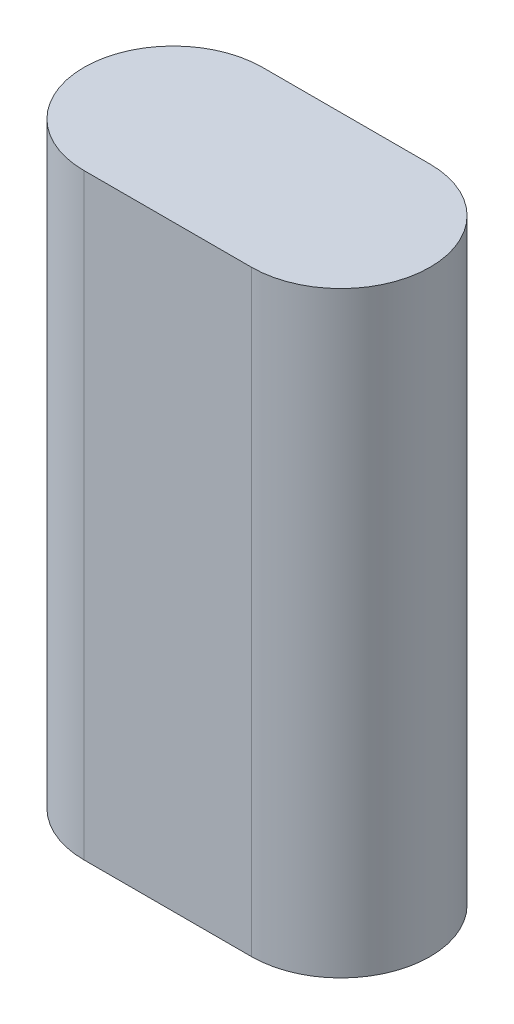
ISO-10303-21;
HEADER;
FILE_DESCRIPTION(('STEP AP214'),'2;1');
FILE_NAME('part.step','',(''),(''),'','','');
FILE_SCHEMA(('AUTOMOTIVE_DESIGN { 1 0 10303 214 1 1 1 1 }'));
ENDSEC;
DATA;
#1=APPLICATION_CONTEXT('core data for automotive mechanical design processes');
#2=APPLICATION_PROTOCOL_DEFINITION('international standard','automotive_design',2000,#1);
#3=PRODUCT_CONTEXT('',#1,'mechanical');
#4=PRODUCT('Part','Part','',(#3));
#5=PRODUCT_RELATED_PRODUCT_CATEGORY('part','',(#4));
#6=PRODUCT_DEFINITION_FORMATION('','',#4);
#7=PRODUCT_DEFINITION_CONTEXT('part definition',#1,'design');
#8=PRODUCT_DEFINITION('design','',#6,#7);
#9=PRODUCT_DEFINITION_SHAPE('','',#8);
#10=(LENGTH_UNIT() NAMED_UNIT(*) SI_UNIT(.MILLI.,.METRE.));
#11=(NAMED_UNIT(*) PLANE_ANGLE_UNIT() SI_UNIT($,.RADIAN.));
#12=(NAMED_UNIT(*) SI_UNIT($,.STERADIAN.) SOLID_ANGLE_UNIT());
#13=UNCERTAINTY_MEASURE_WITH_UNIT(LENGTH_MEASURE(1.E-05),#10,'distance_accuracy_value','');
#14=(GEOMETRIC_REPRESENTATION_CONTEXT(3) GLOBAL_UNCERTAINTY_ASSIGNED_CONTEXT((#13)) GLOBAL_UNIT_ASSIGNED_CONTEXT((#10,
#11,#12)) REPRESENTATION_CONTEXT('',''));
#15=CARTESIAN_POINT('',(0.,0.,0.));
#16=DIRECTION('',(0.,0.,1.));
#17=DIRECTION('',(1.,0.,0.));
#18=AXIS2_PLACEMENT_3D('',#15,#16,#17);
#19=CARTESIAN_POINT('',(-16.7,119.,0.));
#20=DIRECTION('',(0.,-1.,0.));
#21=DIRECTION('',(0.,0.,-1.));
#22=AXIS2_PLACEMENT_3D('',#19,#20,#21);
#23=CYLINDRICAL_SURFACE('',#22,17.8);
#24=CARTESIAN_POINT('',(-16.7,0.,0.));
#25=DIRECTION('',(0.,1.,0.));
#26=DIRECTION('',(0.,0.,1.));
#27=AXIS2_PLACEMENT_3D('',#24,#25,#26);
#28=CIRCLE('',#27,17.8);
#29=CARTESIAN_POINT('',(-16.7,0.,-17.8));
#30=VERTEX_POINT('',#29);
#31=CARTESIAN_POINT('',(-16.7,0.,17.8));
#32=VERTEX_POINT('',#31);
#33=EDGE_CURVE('E99',#30,#32,#28,.T.);
#34=ORIENTED_EDGE('',*,*,#33,.T.);
#35=DIRECTION('',(0.,-1.,0.));
#36=VECTOR('',#35,1.);
#37=CARTESIAN_POINT('',(-16.7,119.,17.8));
#38=LINE('',#37,#36);
#39=CARTESIAN_POINT('',(-16.7,119.,17.8));
#40=VERTEX_POINT('',#39);
#41=EDGE_CURVE('E11',#40,#32,#38,.T.);
#42=ORIENTED_EDGE('',*,*,#41,.F.);
#43=CARTESIAN_POINT('',(-16.7,119.,0.));
#44=DIRECTION('',(0.,1.,0.));
#45=DIRECTION('',(0.,0.,1.));
#46=AXIS2_PLACEMENT_3D('',#43,#44,#45);
#47=CIRCLE('',#46,17.8);
#48=CARTESIAN_POINT('',(-16.7,119.,-17.8));
#49=VERTEX_POINT('',#48);
#50=EDGE_CURVE('E87',#49,#40,#47,.T.);
#51=ORIENTED_EDGE('',*,*,#50,.F.);
#52=DIRECTION('',(0.,-1.,0.));
#53=VECTOR('',#52,1.);
#54=CARTESIAN_POINT('',(-16.7,119.,-17.8));
#55=LINE('',#54,#53);
#56=EDGE_CURVE('E95',#49,#30,#55,.T.);
#57=ORIENTED_EDGE('',*,*,#56,.T.);
#58=EDGE_LOOP('',(#34,#42,#51,#57));
#59=FACE_BOUND('',#58,.T.);
#60=ADVANCED_FACE('F36',(#59),#23,.T.);
#61=CARTESIAN_POINT('',(-16.7,119.,17.8));
#62=DIRECTION('',(0.,0.,-1.));
#63=DIRECTION('',(-1.,0.,0.));
#64=AXIS2_PLACEMENT_3D('',#61,#62,#63);
#65=PLANE('',#64);
#66=DIRECTION('',(1.,0.,0.));
#67=VECTOR('',#66,1.);
#68=CARTESIAN_POINT('',(-16.7,0.,17.8));
#69=LINE('',#68,#67);
#70=CARTESIAN_POINT('',(16.7,0.,17.8));
#71=VERTEX_POINT('',#70);
#72=EDGE_CURVE('E91',#32,#71,#69,.T.);
#73=ORIENTED_EDGE('',*,*,#72,.T.);
#74=DIRECTION('',(0.,-1.,0.));
#75=VECTOR('',#74,1.);
#76=CARTESIAN_POINT('',(16.7,119.,17.8));
#77=LINE('',#76,#75);
#78=CARTESIAN_POINT('',(16.7,119.,17.8));
#79=VERTEX_POINT('',#78);
#80=EDGE_CURVE('E44',#79,#71,#77,.T.);
#81=ORIENTED_EDGE('',*,*,#80,.F.);
#82=DIRECTION('',(1.,0.,0.));
#83=VECTOR('',#82,1.);
#84=CARTESIAN_POINT('',(-16.7,119.,17.8));
#85=LINE('',#84,#83);
#86=EDGE_CURVE('E82',#40,#79,#85,.T.);
#87=ORIENTED_EDGE('',*,*,#86,.F.);
#88=ORIENTED_EDGE('',*,*,#41,.T.);
#89=EDGE_LOOP('',(#73,#81,#87,#88));
#90=FACE_BOUND('',#89,.T.);
#91=ADVANCED_FACE('F90',(#90),#65,.F.);
#92=CARTESIAN_POINT('',(16.7,119.,0.));
#93=DIRECTION('',(0.,-1.,0.));
#94=DIRECTION('',(0.,0.,-1.));
#95=AXIS2_PLACEMENT_3D('',#92,#93,#94);
#96=CYLINDRICAL_SURFACE('',#95,17.8);
#97=CARTESIAN_POINT('',(16.7,0.,0.));
#98=DIRECTION('',(0.,1.,0.));
#99=DIRECTION('',(0.,0.,1.));
#100=AXIS2_PLACEMENT_3D('',#97,#98,#99);
#101=CIRCLE('',#100,17.8);
#102=CARTESIAN_POINT('',(16.7,0.,-17.8));
#103=VERTEX_POINT('',#102);
#104=EDGE_CURVE('E69',#71,#103,#101,.T.);
#105=ORIENTED_EDGE('',*,*,#104,.T.);
#106=DIRECTION('',(0.,-1.,0.));
#107=VECTOR('',#106,1.);
#108=CARTESIAN_POINT('',(16.7,119.,-17.8));
#109=LINE('',#108,#107);
#110=CARTESIAN_POINT('',(16.7,119.,-17.8));
#111=VERTEX_POINT('',#110);
#112=EDGE_CURVE('E92',#111,#103,#109,.T.);
#113=ORIENTED_EDGE('',*,*,#112,.F.);
#114=CARTESIAN_POINT('',(16.7,119.,0.));
#115=DIRECTION('',(0.,1.,0.));
#116=DIRECTION('',(0.,0.,1.));
#117=AXIS2_PLACEMENT_3D('',#114,#115,#116);
#118=CIRCLE('',#117,17.8);
#119=EDGE_CURVE('E85',#79,#111,#118,.T.);
#120=ORIENTED_EDGE('',*,*,#119,.F.);
#121=ORIENTED_EDGE('',*,*,#80,.T.);
#122=EDGE_LOOP('',(#105,#113,#120,#121));
#123=FACE_BOUND('',#122,.T.);
#124=ADVANCED_FACE('F93',(#123),#96,.T.);
#125=CARTESIAN_POINT('',(-16.7,119.,-17.8));
#126=DIRECTION('',(0.,0.,1.));
#127=DIRECTION('',(1.,0.,0.));
#128=AXIS2_PLACEMENT_3D('',#125,#126,#127);
#129=PLANE('',#128);
#130=DIRECTION('',(-1.,0.,0.));
#131=VECTOR('',#130,1.);
#132=CARTESIAN_POINT('',(-16.7,0.,-17.8));
#133=LINE('',#132,#131);
#134=EDGE_CURVE('E75',#103,#30,#133,.T.);
#135=ORIENTED_EDGE('',*,*,#134,.T.);
#136=ORIENTED_EDGE('',*,*,#56,.F.);
#137=DIRECTION('',(-1.,0.,0.));
#138=VECTOR('',#137,1.);
#139=CARTESIAN_POINT('',(-16.7,119.,-17.8));
#140=LINE('',#139,#138);
#141=EDGE_CURVE('E52',#111,#49,#140,.T.);
#142=ORIENTED_EDGE('',*,*,#141,.F.);
#143=ORIENTED_EDGE('',*,*,#112,.T.);
#144=EDGE_LOOP('',(#135,#136,#142,#143));
#145=FACE_BOUND('',#144,.T.);
#146=ADVANCED_FACE('F106',(#145),#129,.F.);
#147=CARTESIAN_POINT('',(-16.7,119.,0.));
#148=DIRECTION('',(0.,1.,0.));
#149=DIRECTION('',(0.,0.,1.));
#150=AXIS2_PLACEMENT_3D('',#147,#148,#149);
#151=PLANE('',#150);
#152=ORIENTED_EDGE('',*,*,#50,.T.);
#153=ORIENTED_EDGE('',*,*,#86,.T.);
#154=ORIENTED_EDGE('',*,*,#119,.T.);
#155=ORIENTED_EDGE('',*,*,#141,.T.);
#156=EDGE_LOOP('',(#152,#153,#154,#155));
#157=FACE_BOUND('',#156,.T.);
#158=ADVANCED_FACE('F83',(#157),#151,.T.);
#159=CARTESIAN_POINT('',(-16.7,0.,0.));
#160=DIRECTION('',(0.,1.,0.));
#161=DIRECTION('',(0.,0.,1.));
#162=AXIS2_PLACEMENT_3D('',#159,#160,#161);
#163=PLANE('',#162);
#164=ORIENTED_EDGE('',*,*,#33,.F.);
#165=ORIENTED_EDGE('',*,*,#134,.F.);
#166=ORIENTED_EDGE('',*,*,#104,.F.);
#167=ORIENTED_EDGE('',*,*,#72,.F.);
#168=EDGE_LOOP('',(#164,#165,#166,#167));
#169=FACE_BOUND('',#168,.T.);
#170=ADVANCED_FACE('F109',(#169),#163,.F.);
#171=CLOSED_SHELL('',(#60,#91,#124,#146,#158,#170));
#172=MANIFOLD_SOLID_BREP('B2',#171);
#173=ADVANCED_BREP_SHAPE_REPRESENTATION('',(#18,#172),#14);
#174=SHAPE_DEFINITION_REPRESENTATION(#9,#173);
ENDSEC;
END-ISO-10303-21;
